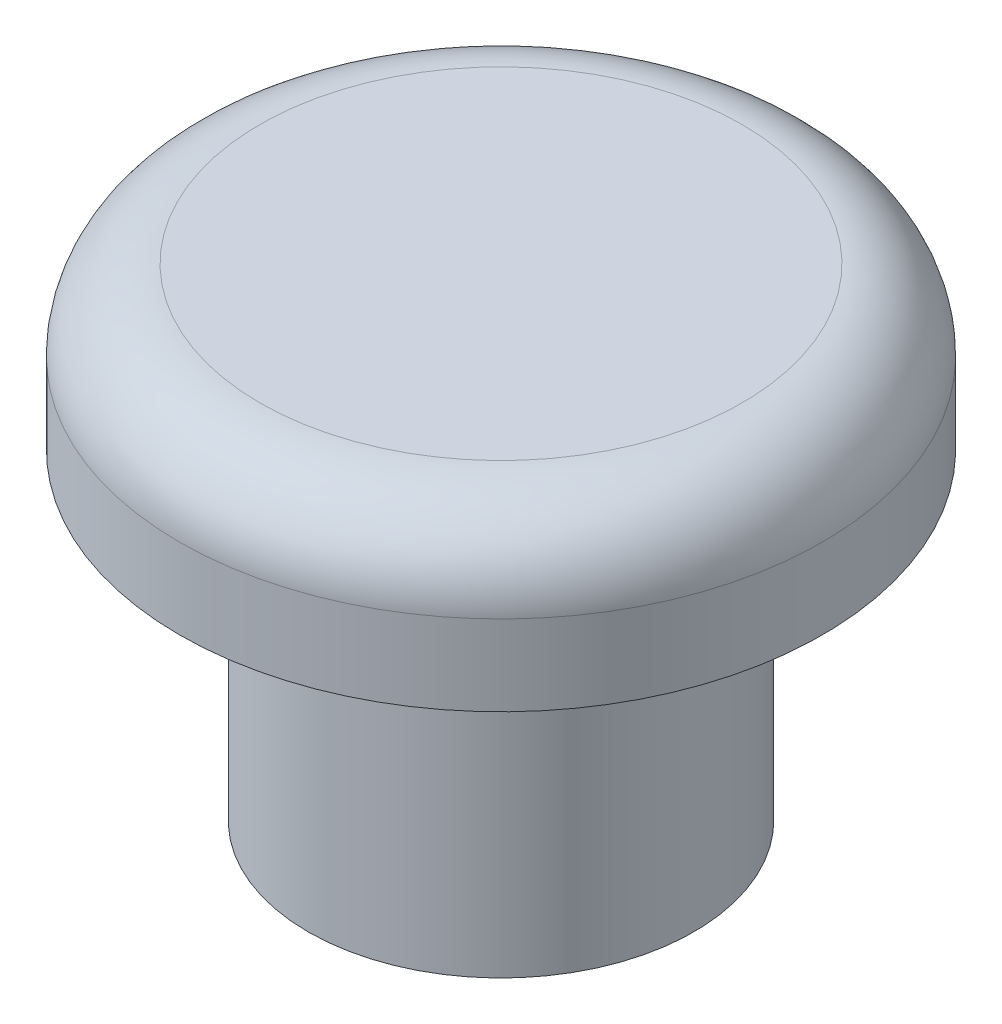
ISO-10303-21;
HEADER;
FILE_DESCRIPTION(('STEP AP214'),'2;1');
FILE_NAME('part.step','',(''),(''),'','','');
FILE_SCHEMA(('AUTOMOTIVE_DESIGN { 1 0 10303 214 1 1 1 1 }'));
ENDSEC;
DATA;
#1=APPLICATION_CONTEXT('core data for automotive mechanical design processes');
#2=APPLICATION_PROTOCOL_DEFINITION('international standard','automotive_design',2000,#1);
#3=PRODUCT_CONTEXT('',#1,'mechanical');
#4=PRODUCT('Part','Part','',(#3));
#5=PRODUCT_RELATED_PRODUCT_CATEGORY('part','',(#4));
#6=PRODUCT_DEFINITION_FORMATION('','',#4);
#7=PRODUCT_DEFINITION_CONTEXT('part definition',#1,'design');
#8=PRODUCT_DEFINITION('design','',#6,#7);
#9=PRODUCT_DEFINITION_SHAPE('','',#8);
#10=(LENGTH_UNIT() NAMED_UNIT(*) SI_UNIT(.MILLI.,.METRE.));
#11=(NAMED_UNIT(*) PLANE_ANGLE_UNIT() SI_UNIT($,.RADIAN.));
#12=(NAMED_UNIT(*) SI_UNIT($,.STERADIAN.) SOLID_ANGLE_UNIT());
#13=UNCERTAINTY_MEASURE_WITH_UNIT(LENGTH_MEASURE(1.E-05),#10,'distance_accuracy_value','');
#14=(GEOMETRIC_REPRESENTATION_CONTEXT(3) GLOBAL_UNCERTAINTY_ASSIGNED_CONTEXT((#13)) GLOBAL_UNIT_ASSIGNED_CONTEXT((#10,
#11,#12)) REPRESENTATION_CONTEXT('',''));
#15=CARTESIAN_POINT('',(0.,0.,0.));
#16=DIRECTION('',(0.,0.,1.));
#17=DIRECTION('',(1.,0.,0.));
#18=AXIS2_PLACEMENT_3D('',#15,#16,#17);
#19=CARTESIAN_POINT('',(0.,0.,0.));
#20=DIRECTION('',(0.,1.,0.));
#21=DIRECTION('',(0.,0.,1.));
#22=AXIS2_PLACEMENT_3D('',#19,#20,#21);
#23=PLANE('',#22);
#24=CARTESIAN_POINT('',(0.,0.,0.));
#25=DIRECTION('',(0.,1.,0.));
#26=DIRECTION('',(0.,0.,1.));
#27=AXIS2_PLACEMENT_3D('',#24,#25,#26);
#28=CIRCLE('',#27,6.);
#29=CARTESIAN_POINT('',(0.,0.,6.));
#30=VERTEX_POINT('',#29);
#31=EDGE_CURVE('E45',#30,#30,#28,.T.);
#32=ORIENTED_EDGE('',*,*,#31,.F.);
#33=EDGE_LOOP('',(#32));
#34=FACE_BOUND('',#33,.T.);
#35=CARTESIAN_POINT('',(0.,0.,0.));
#36=DIRECTION('',(0.,1.,0.));
#37=DIRECTION('',(0.,0.,1.));
#38=AXIS2_PLACEMENT_3D('',#35,#36,#37);
#39=CIRCLE('',#38,4.075);
#40=CARTESIAN_POINT('',(0.,0.,4.075));
#41=VERTEX_POINT('',#40);
#42=EDGE_CURVE('E49',#41,#41,#39,.T.);
#43=ORIENTED_EDGE('',*,*,#42,.T.);
#44=EDGE_LOOP('',(#43));
#45=FACE_BOUND('',#44,.T.);
#46=ADVANCED_FACE('F30',(#34,#45),#23,.F.);
#47=CARTESIAN_POINT('',(0.,10.,0.));
#48=DIRECTION('',(0.,-1.,0.));
#49=DIRECTION('',(0.,0.,-1.));
#50=AXIS2_PLACEMENT_3D('',#47,#48,#49);
#51=CYLINDRICAL_SURFACE('',#50,6.);
#52=CARTESIAN_POINT('',(0.,10.,0.));
#53=DIRECTION('',(0.,1.,0.));
#54=DIRECTION('',(0.,0.,1.));
#55=AXIS2_PLACEMENT_3D('',#52,#53,#54);
#56=CIRCLE('',#55,6.);
#57=CARTESIAN_POINT('',(0.,10.,6.));
#58=VERTEX_POINT('',#57);
#59=EDGE_CURVE('E41',#58,#58,#56,.T.);
#60=ORIENTED_EDGE('',*,*,#59,.F.);
#61=EDGE_LOOP('',(#60));
#62=FACE_BOUND('',#61,.T.);
#63=ORIENTED_EDGE('',*,*,#31,.T.);
#64=EDGE_LOOP('',(#63));
#65=FACE_BOUND('',#64,.T.);
#66=ADVANCED_FACE('F79',(#62,#65),#51,.T.);
#67=CARTESIAN_POINT('',(0.,10.,0.));
#68=DIRECTION('',(0.,-1.,0.));
#69=DIRECTION('',(0.,0.,-1.));
#70=AXIS2_PLACEMENT_3D('',#67,#68,#69);
#71=CYLINDRICAL_SURFACE('',#70,4.075);
#72=CARTESIAN_POINT('',(0.,10.,0.));
#73=DIRECTION('',(0.,1.,0.));
#74=DIRECTION('',(0.,0.,1.));
#75=AXIS2_PLACEMENT_3D('',#72,#73,#74);
#76=CIRCLE('',#75,4.075);
#77=CARTESIAN_POINT('',(0.,10.,4.075));
#78=VERTEX_POINT('',#77);
#79=EDGE_CURVE('E53',#78,#78,#76,.T.);
#80=ORIENTED_EDGE('',*,*,#79,.T.);
#81=EDGE_LOOP('',(#80));
#82=FACE_BOUND('',#81,.T.);
#83=ORIENTED_EDGE('',*,*,#42,.F.);
#84=EDGE_LOOP('',(#83));
#85=FACE_BOUND('',#84,.T.);
#86=ADVANCED_FACE('F76',(#82,#85),#71,.F.);
#87=CARTESIAN_POINT('',(0.,10.,0.));
#88=DIRECTION('',(0.,1.,0.));
#89=DIRECTION('',(0.,0.,1.));
#90=AXIS2_PLACEMENT_3D('',#87,#88,#89);
#91=PLANE('',#90);
#92=ORIENTED_EDGE('',*,*,#79,.F.);
#93=EDGE_LOOP('',(#92));
#94=FACE_BOUND('',#93,.T.);
#95=ADVANCED_FACE('F67',(#94),#91,.F.);
#96=CARTESIAN_POINT('',(0.,15.,0.));
#97=DIRECTION('',(0.,-1.,0.));
#98=DIRECTION('',(0.,0.,-1.));
#99=AXIS2_PLACEMENT_3D('',#96,#97,#98);
#100=CYLINDRICAL_SURFACE('',#99,10.);
#101=CARTESIAN_POINT('',(0.,12.5,0.));
#102=DIRECTION('',(0.,1.,0.));
#103=DIRECTION('',(0.,0.,1.));
#104=AXIS2_PLACEMENT_3D('',#101,#102,#103);
#105=CIRCLE('',#104,10.);
#106=CARTESIAN_POINT('',(0.,12.5,10.));
#107=VERTEX_POINT('',#106);
#108=EDGE_CURVE('E10',#107,#107,#105,.F.);
#109=ORIENTED_EDGE('',*,*,#108,.T.);
#110=EDGE_LOOP('',(#109));
#111=FACE_BOUND('',#110,.T.);
#112=CARTESIAN_POINT('',(0.,10.,0.));
#113=DIRECTION('',(0.,1.,0.));
#114=DIRECTION('',(0.,0.,1.));
#115=AXIS2_PLACEMENT_3D('',#112,#113,#114);
#116=CIRCLE('',#115,10.);
#117=CARTESIAN_POINT('',(0.,10.,10.));
#118=VERTEX_POINT('',#117);
#119=EDGE_CURVE('E56',#118,#118,#116,.T.);
#120=ORIENTED_EDGE('',*,*,#119,.T.);
#121=EDGE_LOOP('',(#120));
#122=FACE_BOUND('',#121,.T.);
#123=ADVANCED_FACE('F60',(#111,#122),#100,.T.);
#124=CARTESIAN_POINT('',(0.,15.,0.));
#125=DIRECTION('',(0.,1.,0.));
#126=DIRECTION('',(0.,0.,1.));
#127=AXIS2_PLACEMENT_3D('',#124,#125,#126);
#128=PLANE('',#127);
#129=CARTESIAN_POINT('',(0.,15.,0.));
#130=DIRECTION('',(0.,1.,0.));
#131=DIRECTION('',(0.,0.,1.));
#132=AXIS2_PLACEMENT_3D('',#129,#130,#131);
#133=CIRCLE('',#132,7.5);
#134=CARTESIAN_POINT('',(0.,15.,7.5));
#135=VERTEX_POINT('',#134);
#136=EDGE_CURVE('E37',#135,#135,#133,.T.);
#137=ORIENTED_EDGE('',*,*,#136,.T.);
#138=EDGE_LOOP('',(#137));
#139=FACE_BOUND('',#138,.T.);
#140=ADVANCED_FACE('F64',(#139),#128,.T.);
#141=ORIENTED_EDGE('',*,*,#59,.T.);
#142=EDGE_LOOP('',(#141));
#143=FACE_BOUND('',#142,.T.);
#144=ORIENTED_EDGE('',*,*,#119,.F.);
#145=EDGE_LOOP('',(#144));
#146=FACE_BOUND('',#145,.T.);
#147=ADVANCED_FACE('F62',(#143,#146),#91,.F.);
#148=CARTESIAN_POINT('',(0.,12.5,0.));
#149=DIRECTION('',(0.,1.,0.));
#150=DIRECTION('',(0.,0.,1.));
#151=AXIS2_PLACEMENT_3D('',#148,#149,#150);
#152=TOROIDAL_SURFACE('',#151,7.5,2.5);
#153=ORIENTED_EDGE('',*,*,#108,.F.);
#154=EDGE_LOOP('',(#153));
#155=FACE_BOUND('',#154,.T.);
#156=ORIENTED_EDGE('',*,*,#136,.F.);
#157=EDGE_LOOP('',(#156));
#158=FACE_BOUND('',#157,.T.);
#159=ADVANCED_FACE('F32',(#155,#158),#152,.T.);
#160=CLOSED_SHELL('',(#46,#66,#86,#95,#123,#140,#147,#159));
#161=MANIFOLD_SOLID_BREP('B2',#160);
#162=ADVANCED_BREP_SHAPE_REPRESENTATION('',(#18,#161),#14);
#163=SHAPE_DEFINITION_REPRESENTATION(#9,#162);
ENDSEC;
END-ISO-10303-21;
